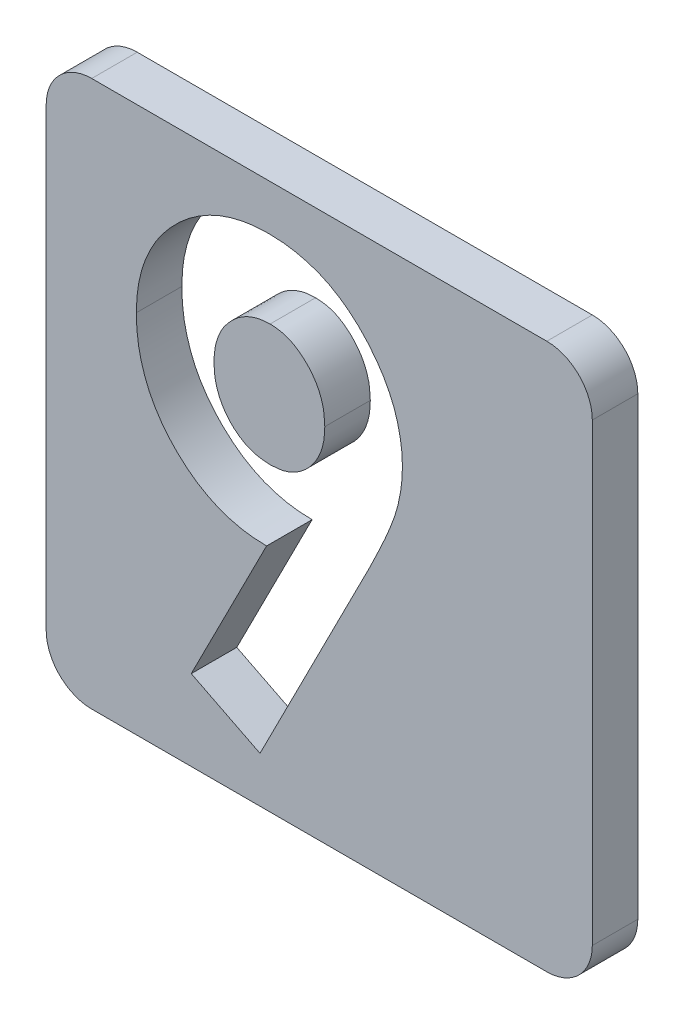
ISO-10303-21;
HEADER;
FILE_DESCRIPTION(('STEP AP214'),'2;1');
FILE_NAME('part.step','',(''),(''),'','','');
FILE_SCHEMA(('AUTOMOTIVE_DESIGN { 1 0 10303 214 1 1 1 1 }'));
ENDSEC;
DATA;
#1=APPLICATION_CONTEXT('core data for automotive mechanical design processes');
#2=APPLICATION_PROTOCOL_DEFINITION('international standard','automotive_design',2000,#1);
#3=PRODUCT_CONTEXT('',#1,'mechanical');
#4=PRODUCT('Part','Part','',(#3));
#5=PRODUCT_RELATED_PRODUCT_CATEGORY('part','',(#4));
#6=PRODUCT_DEFINITION_FORMATION('','',#4);
#7=PRODUCT_DEFINITION_CONTEXT('part definition',#1,'design');
#8=PRODUCT_DEFINITION('design','',#6,#7);
#9=PRODUCT_DEFINITION_SHAPE('','',#8);
#10=(LENGTH_UNIT() NAMED_UNIT(*) SI_UNIT(.MILLI.,.METRE.));
#11=(NAMED_UNIT(*) PLANE_ANGLE_UNIT() SI_UNIT($,.RADIAN.));
#12=(NAMED_UNIT(*) SI_UNIT($,.STERADIAN.) SOLID_ANGLE_UNIT());
#13=UNCERTAINTY_MEASURE_WITH_UNIT(LENGTH_MEASURE(1.E-05),#10,'distance_accuracy_value','');
#14=(GEOMETRIC_REPRESENTATION_CONTEXT(3) GLOBAL_UNCERTAINTY_ASSIGNED_CONTEXT((#13)) GLOBAL_UNIT_ASSIGNED_CONTEXT((#10,
#11,#12)) REPRESENTATION_CONTEXT('',''));
#15=CARTESIAN_POINT('',(0.,0.,0.));
#16=DIRECTION('',(0.,0.,1.));
#17=DIRECTION('',(1.,0.,0.));
#18=AXIS2_PLACEMENT_3D('',#15,#16,#17);
#19=CARTESIAN_POINT('',(50.,50.,10.));
#20=DIRECTION('',(0.,0.,-1.));
#21=DIRECTION('',(-1.,0.,0.));
#22=AXIS2_PLACEMENT_3D('',#19,#20,#21);
#23=PLANE('',#22);
#24=DIRECTION('',(1.,0.,0.));
#25=VECTOR('',#24,1.);
#26=CARTESIAN_POINT('',(-49.9999999999999,60.,10.));
#27=LINE('',#26,#25);
#28=CARTESIAN_POINT('',(-49.9999999999999,60.,10.));
#29=VERTEX_POINT('',#28);
#30=CARTESIAN_POINT('',(49.9999999999999,60.,10.));
#31=VERTEX_POINT('',#30);
#32=EDGE_CURVE('E280',#29,#31,#27,.T.);
#33=ORIENTED_EDGE('',*,*,#32,.F.);
#34=CARTESIAN_POINT('',(-50.,50.,10.));
#35=DIRECTION('',(0.,0.,1.));
#36=DIRECTION('',(1.,0.,0.));
#37=AXIS2_PLACEMENT_3D('',#34,#35,#36);
#38=CIRCLE('',#37,10.);
#39=CARTESIAN_POINT('',(-60.,49.9999999999999,10.));
#40=VERTEX_POINT('',#39);
#41=EDGE_CURVE('E301',#29,#40,#38,.T.);
#42=ORIENTED_EDGE('',*,*,#41,.T.);
#43=DIRECTION('',(0.,-1.,0.));
#44=VECTOR('',#43,1.);
#45=CARTESIAN_POINT('',(-60.,49.9999999999999,10.));
#46=LINE('',#45,#44);
#47=CARTESIAN_POINT('',(-60.,-49.9999999999999,10.));
#48=VERTEX_POINT('',#47);
#49=EDGE_CURVE('E299',#40,#48,#46,.T.);
#50=ORIENTED_EDGE('',*,*,#49,.T.);
#51=CARTESIAN_POINT('',(-50.,-50.,10.));
#52=DIRECTION('',(0.,0.,1.));
#53=DIRECTION('',(1.,0.,0.));
#54=AXIS2_PLACEMENT_3D('',#51,#52,#53);
#55=CIRCLE('',#54,10.);
#56=CARTESIAN_POINT('',(-49.9999999999999,-60.,10.));
#57=VERTEX_POINT('',#56);
#58=EDGE_CURVE('E297',#48,#57,#55,.T.);
#59=ORIENTED_EDGE('',*,*,#58,.T.);
#60=DIRECTION('',(1.,0.,0.));
#61=VECTOR('',#60,1.);
#62=CARTESIAN_POINT('',(-49.9999999999999,-60.,10.));
#63=LINE('',#62,#61);
#64=CARTESIAN_POINT('',(49.9999999999999,-60.,10.));
#65=VERTEX_POINT('',#64);
#66=EDGE_CURVE('E295',#57,#65,#63,.T.);
#67=ORIENTED_EDGE('',*,*,#66,.T.);
#68=CARTESIAN_POINT('',(50.,-50.,10.));
#69=DIRECTION('',(0.,0.,1.));
#70=DIRECTION('',(1.,0.,0.));
#71=AXIS2_PLACEMENT_3D('',#68,#69,#70);
#72=CIRCLE('',#71,10.);
#73=CARTESIAN_POINT('',(60.,-50.,10.));
#74=VERTEX_POINT('',#73);
#75=EDGE_CURVE('E186',#65,#74,#72,.T.);
#76=ORIENTED_EDGE('',*,*,#75,.T.);
#77=DIRECTION('',(0.,-1.,0.));
#78=VECTOR('',#77,1.);
#79=CARTESIAN_POINT('',(60.,49.9999999999999,10.));
#80=LINE('',#79,#78);
#81=CARTESIAN_POINT('',(60.,49.9999999999999,10.));
#82=VERTEX_POINT('',#81);
#83=EDGE_CURVE('E290',#82,#74,#80,.T.);
#84=ORIENTED_EDGE('',*,*,#83,.F.);
#85=CARTESIAN_POINT('',(50.,50.,10.));
#86=DIRECTION('',(0.,0.,-1.));
#87=DIRECTION('',(-1.,0.,0.));
#88=AXIS2_PLACEMENT_3D('',#85,#86,#87);
#89=CIRCLE('',#88,10.);
#90=EDGE_CURVE('E285',#31,#82,#89,.T.);
#91=ORIENTED_EDGE('',*,*,#90,.F.);
#92=EDGE_LOOP('',(#33,#42,#50,#59,#67,#76,#84,#91));
#93=FACE_BOUND('',#92,.T.);
#94=DIRECTION('',(-0.453063813676766,-0.891478087636855,0.));
#95=VECTOR('',#94,1.);
#96=CARTESIAN_POINT('',(11.1137820512821,-2.45492788461538,10.));
#97=LINE('',#96,#95);
#98=CARTESIAN_POINT('',(11.1137820512821,-2.45492788461538,10.));
#99=VERTEX_POINT('',#98);
#100=CARTESIAN_POINT('',(-13.0168269230769,-49.9358974358974,10.));
#101=VERTEX_POINT('',#100);
#102=EDGE_CURVE('E99',#99,#101,#97,.T.);
#103=ORIENTED_EDGE('',*,*,#102,.T.);
#104=DIRECTION('',(-0.893073384293623,0.44991102483306,0.));
#105=VECTOR('',#104,1.);
#106=CARTESIAN_POINT('',(-13.0168269230769,-49.9358974358974,10.));
#107=LINE('',#106,#105);
#108=CARTESIAN_POINT('',(-28.1270032051282,-42.3237179487179,10.));
#109=VERTEX_POINT('',#108);
#110=EDGE_CURVE('E89',#101,#109,#107,.T.);
#111=ORIENTED_EDGE('',*,*,#110,.T.);
#112=DIRECTION('',(0.453036279251149,0.891492080549387,0.));
#113=VECTOR('',#112,1.);
#114=CARTESIAN_POINT('',(-28.1270032051282,-42.3237179487179,10.));
#115=LINE('',#114,#113);
#116=CARTESIAN_POINT('',(-11.5705128205128,-9.74358974358974,10.));
#117=VERTEX_POINT('',#116);
#118=EDGE_CURVE('E162',#109,#117,#115,.T.);
#119=ORIENTED_EDGE('',*,*,#118,.T.);
#120=CARTESIAN_POINT('',(-11.5705128205128,-9.74358974358974,10.));
#121=CARTESIAN_POINT('',(-12.5487082784052,-9.71865684169117,10.));
#122=CARTESIAN_POINT('',(-14.4691426352712,-9.66970752278353,10.));
#123=CARTESIAN_POINT('',(-17.2968324055117,-9.26293912647587,10.));
#124=CARTESIAN_POINT('',(-20.0008840528839,-8.5685595136517,10.));
#125=CARTESIAN_POINT('',(-22.6131694405603,-7.64416532013707,10.));
#126=CARTESIAN_POINT('',(-25.097561487791,-6.40491911821241,10.));
#127=CARTESIAN_POINT('',(-27.4841854350134,-4.9259438080766,10.));
#128=CARTESIAN_POINT('',(-29.7400023394509,-3.14897623344527,10.));
#129=CARTESIAN_POINT('',(-31.87558877679,-1.15159120433424,10.));
#130=CARTESIAN_POINT('',(-33.8254474477791,1.05616578589798,10.));
#131=CARTESIAN_POINT('',(-35.5178835270646,3.43057106437143,10.));
#132=CARTESIAN_POINT('',(-36.9930362417693,5.911392924908,10.));
#133=CARTESIAN_POINT('',(-38.1401959046651,8.55463771705473,10.));
#134=CARTESIAN_POINT('',(-39.0616003817339,11.3110419237815,10.));
#135=CARTESIAN_POINT('',(-39.7348249532374,14.1948729963102,10.));
#136=CARTESIAN_POINT('',(-40.1126207772804,17.2187833329912,10.));
#137=CARTESIAN_POINT('',(-40.1654259378608,19.2768236366779,10.));
#138=CARTESIAN_POINT('',(-40.1923076923077,20.3245192307692,10.));
#139=B_SPLINE_CURVE_WITH_KNOTS('',3,(#120,#121,#122,#123,#124,#125,#126,#127,#128,#129,#130,
#131,#132,#133,#134,#135,#136,#137,#138),.UNSPECIFIED.,.F.,.F.,(4,1,1,1,1,1,1,1,1,1,1,1,1,1,1,1,
4),(0.,0.0633960183629043,0.124461722624391,0.184704908663736,0.244152607009593,
0.303740956361286,0.364332634738895,0.42586459095349,0.489579919718536,0.553682917096973,
0.61645160827579,0.678378074395185,0.7404259476886,0.802847463493209,0.866590655815861,
0.932084720662687,1.),.UNSPECIFIED.);
#140=CARTESIAN_POINT('',(-40.1923076923077,20.3245192307692,10.));
#141=VERTEX_POINT('',#140);
#142=EDGE_CURVE('E170',#117,#141,#139,.T.);
#143=ORIENTED_EDGE('',*,*,#142,.T.);
#144=CARTESIAN_POINT('',(-40.1923076923077,20.3245192307692,10.));
#145=CARTESIAN_POINT('',(-40.1673733997281,21.3407736328703,10.));
#146=CARTESIAN_POINT('',(-40.1182408920945,23.3432819057518,10.));
#147=CARTESIAN_POINT('',(-39.710190668345,26.2823123746299,10.));
#148=CARTESIAN_POINT('',(-39.0386456077103,29.1042110067751,10.));
#149=CARTESIAN_POINT('',(-38.1173098436622,31.8084984034038,10.));
#150=CARTESIAN_POINT('',(-36.8907774827536,34.3769390831891,10.));
#151=CARTESIAN_POINT('',(-35.455152573334,36.8497488680693,10.));
#152=CARTESIAN_POINT('',(-33.7001662598546,39.175767992265,10.));
#153=CARTESIAN_POINT('',(-31.7176287709224,41.36506579395,10.));
#154=CARTESIAN_POINT('',(-29.5478467051494,43.3678867288314,10.));
#155=CARTESIAN_POINT('',(-27.2458900687447,45.1288557751048,10.));
#156=CARTESIAN_POINT('',(-24.8222255223714,46.6008566917462,10.));
#157=CARTESIAN_POINT('',(-22.3079995576388,47.8370659065537,10.));
#158=CARTESIAN_POINT('',(-19.6577657129372,48.7606845299356,10.));
#159=CARTESIAN_POINT('',(-16.9098228358612,49.4575479363277,10.));
#160=CARTESIAN_POINT('',(-14.0437005674087,49.8597377152276,10.));
#161=CARTESIAN_POINT('',(-12.0982365477929,49.9103077210116,10.));
#162=CARTESIAN_POINT('',(-11.1137820512821,49.9358974358974,10.));
#163=B_SPLINE_CURVE_WITH_KNOTS('',3,(#144,#145,#146,#147,#148,#149,#150,#151,#152,#153,#154,
#155,#156,#157,#158,#159,#160,#161,#162),.UNSPECIFIED.,.F.,.F.,(4,1,1,1,1,1,1,1,1,1,1,1,1,1,1,1,
4),(0.,0.0659711673855696,0.12999482037974,0.192240605438808,0.254118655473896,
0.315112885237514,0.376787677634344,0.439482994641294,0.503934568554464,0.568359809906512,
0.630973880248219,0.6918009640577,0.752229223324359,0.812552090511615,0.873694973395468,
0.936086429705698,1.),.UNSPECIFIED.);
#164=CARTESIAN_POINT('',(-11.1137820512821,49.9358974358974,10.));
#165=VERTEX_POINT('',#164);
#166=EDGE_CURVE('E177',#141,#165,#163,.T.);
#167=ORIENTED_EDGE('',*,*,#166,.T.);
#168=CARTESIAN_POINT('',(-11.1137820512821,49.9358974358974,10.));
#169=CARTESIAN_POINT('',(-10.0844157877673,49.9147090444259,10.));
#170=CARTESIAN_POINT('',(-8.06030630915738,49.8730449394964,10.));
#171=CARTESIAN_POINT('',(-5.0972818468453,49.4132979731475,10.));
#172=CARTESIAN_POINT('',(-2.26237997427785,48.7079620288691,10.));
#173=CARTESIAN_POINT('',(0.455917974564816,47.7499719235781,10.));
#174=CARTESIAN_POINT('',(3.02386547494618,46.4497810679591,10.));
#175=CARTESIAN_POINT('',(5.46294979104408,44.8914932713447,10.));
#176=CARTESIAN_POINT('',(7.76505775226842,43.040630392274,10.));
#177=CARTESIAN_POINT('',(9.90546641613935,40.9505400356585,10.));
#178=CARTESIAN_POINT('',(11.8521441750213,38.6771757182083,10.));
#179=CARTESIAN_POINT('',(13.5776317876263,36.2975117085108,10.));
#180=CARTESIAN_POINT('',(15.0271146374738,33.8162009274539,10.));
#181=CARTESIAN_POINT('',(16.2143297542985,31.2553882185978,10.));
#182=CARTESIAN_POINT('',(17.1391643544446,28.6110617628975,10.));
#183=CARTESIAN_POINT('',(17.7748702771179,25.8794706898304,10.));
#184=CARTESIAN_POINT('',(18.1969085044112,23.0652861386496,10.));
#185=CARTESIAN_POINT('',(18.244928030853,21.1570610395622,10.));
#186=CARTESIAN_POINT('',(18.2692307692308,20.1913060897436,10.));
#187=B_SPLINE_CURVE_WITH_KNOTS('',3,(#168,#169,#170,#171,#172,#173,#174,#175,#176,#177,#178,
#179,#180,#181,#182,#183,#184,#185,#186),.UNSPECIFIED.,.F.,.F.,(4,1,1,1,1,1,1,1,1,1,1,1,1,1,1,1,
4),(0.,0.0664266296749589,0.130618979388443,0.193114419668131,0.254924025574817,
0.316297675546927,0.378571182906922,0.441525471023996,0.50670755899362,0.571491939544167,
0.634591343635348,0.696280008578515,0.756765385876679,0.816620428487902,0.876834678656504,
0.93766588711659,1.),.UNSPECIFIED.);
#188=CARTESIAN_POINT('',(18.2692307692308,20.1913060897436,10.));
#189=VERTEX_POINT('',#188);
#190=EDGE_CURVE('E256',#165,#189,#187,.T.);
#191=ORIENTED_EDGE('',*,*,#190,.T.);
#192=CARTESIAN_POINT('',(18.2692307692308,20.1913060897436,10.));
#193=CARTESIAN_POINT('',(18.2559685385925,19.4547477210231,10.));
#194=CARTESIAN_POINT('',(18.2292554242534,17.9711535612039,10.));
#195=CARTESIAN_POINT('',(17.9665917922663,15.7463433011461,10.));
#196=CARTESIAN_POINT('',(17.5680781384173,13.5153667573277,10.));
#197=CARTESIAN_POINT('',(17.1055186865444,11.6396688126471,10.));
#198=CARTESIAN_POINT('',(16.6205894510406,10.0585693740338,10.));
#199=CARTESIAN_POINT('',(16.1486980801047,8.71729972019781,10.));
#200=CARTESIAN_POINT('',(15.5432475600032,7.22823857101684,10.));
#201=CARTESIAN_POINT('',(14.8672015376338,5.58140509080897,10.));
#202=CARTESIAN_POINT('',(14.0842606766268,3.78402084299924,10.));
#203=CARTESIAN_POINT('',(13.1781921387281,1.84467800865937,10.));
#204=CARTESIAN_POINT('',(12.2037562238721,-0.265385795089937,10.));
#205=CARTESIAN_POINT('',(11.4855007657905,-1.70821865851829,10.));
#206=CARTESIAN_POINT('',(11.1137820512821,-2.45492788461538,10.));
#207=B_SPLINE_CURVE_WITH_KNOTS('',3,(#192,#193,#194,#195,#196,#197,#198,#199,#200,#201,#202,
#203,#204,#205,#206),.UNSPECIFIED.,.F.,.F.,(4,1,1,1,1,1,1,1,1,1,1,1,4),(0.,0.0920943170852741,
0.185498660774979,0.279815204103102,0.375457413897099,0.426909121720572,0.48663397338517,
0.553231376301778,0.627937493472951,0.709307196629626,0.798417104070447,0.895674813050554,1.),.UNSPECIFIED.);
#208=EDGE_CURVE('E257',#189,#99,#207,.T.);
#209=ORIENTED_EDGE('',*,*,#208,.T.);
#210=EDGE_LOOP('',(#103,#111,#119,#143,#167,#191,#209));
#211=FACE_BOUND('',#210,.T.);
#212=ADVANCED_FACE('F43',(#93,#211),#23,.F.);
#213=CARTESIAN_POINT('',(50.,50.,0.));
#214=DIRECTION('',(0.,0.,-1.));
#215=DIRECTION('',(-1.,0.,0.));
#216=AXIS2_PLACEMENT_3D('',#213,#214,#215);
#217=PLANE('',#216);
#218=DIRECTION('',(1.,0.,0.));
#219=VECTOR('',#218,1.);
#220=CARTESIAN_POINT('',(-49.9999999999999,60.,0.));
#221=LINE('',#220,#219);
#222=CARTESIAN_POINT('',(-49.9999999999999,60.,0.));
#223=VERTEX_POINT('',#222);
#224=CARTESIAN_POINT('',(49.9999999999999,60.,0.));
#225=VERTEX_POINT('',#224);
#226=EDGE_CURVE('E223',#223,#225,#221,.T.);
#227=ORIENTED_EDGE('',*,*,#226,.T.);
#228=CARTESIAN_POINT('',(50.,50.,0.));
#229=DIRECTION('',(0.,0.,-1.));
#230=DIRECTION('',(-1.,0.,0.));
#231=AXIS2_PLACEMENT_3D('',#228,#229,#230);
#232=CIRCLE('',#231,10.);
#233=CARTESIAN_POINT('',(60.,49.9999999999999,0.));
#234=VERTEX_POINT('',#233);
#235=EDGE_CURVE('E304',#225,#234,#232,.T.);
#236=ORIENTED_EDGE('',*,*,#235,.T.);
#237=DIRECTION('',(0.,-1.,0.));
#238=VECTOR('',#237,1.);
#239=CARTESIAN_POINT('',(60.,49.9999999999999,0.));
#240=LINE('',#239,#238);
#241=CARTESIAN_POINT('',(60.,-50.,0.));
#242=VERTEX_POINT('',#241);
#243=EDGE_CURVE('E284',#234,#242,#240,.T.);
#244=ORIENTED_EDGE('',*,*,#243,.T.);
#245=CARTESIAN_POINT('',(50.,-50.,0.));
#246=DIRECTION('',(0.,0.,1.));
#247=DIRECTION('',(1.,0.,0.));
#248=AXIS2_PLACEMENT_3D('',#245,#246,#247);
#249=CIRCLE('',#248,10.);
#250=CARTESIAN_POINT('',(49.9999999999999,-60.,0.));
#251=VERTEX_POINT('',#250);
#252=EDGE_CURVE('E308',#251,#242,#249,.T.);
#253=ORIENTED_EDGE('',*,*,#252,.F.);
#254=DIRECTION('',(1.,0.,0.));
#255=VECTOR('',#254,1.);
#256=CARTESIAN_POINT('',(-49.9999999999999,-60.,0.));
#257=LINE('',#256,#255);
#258=CARTESIAN_POINT('',(-49.9999999999999,-60.,0.));
#259=VERTEX_POINT('',#258);
#260=EDGE_CURVE('E312',#259,#251,#257,.T.);
#261=ORIENTED_EDGE('',*,*,#260,.F.);
#262=CARTESIAN_POINT('',(-50.,-50.,0.));
#263=DIRECTION('',(0.,0.,1.));
#264=DIRECTION('',(1.,0.,0.));
#265=AXIS2_PLACEMENT_3D('',#262,#263,#264);
#266=CIRCLE('',#265,10.);
#267=CARTESIAN_POINT('',(-60.,-49.9999999999999,0.));
#268=VERTEX_POINT('',#267);
#269=EDGE_CURVE('E315',#268,#259,#266,.T.);
#270=ORIENTED_EDGE('',*,*,#269,.F.);
#271=DIRECTION('',(0.,-1.,0.));
#272=VECTOR('',#271,1.);
#273=CARTESIAN_POINT('',(-60.,49.9999999999999,0.));
#274=LINE('',#273,#272);
#275=CARTESIAN_POINT('',(-60.,49.9999999999999,0.));
#276=VERTEX_POINT('',#275);
#277=EDGE_CURVE('E318',#276,#268,#274,.T.);
#278=ORIENTED_EDGE('',*,*,#277,.F.);
#279=CARTESIAN_POINT('',(-50.,50.,0.));
#280=DIRECTION('',(0.,0.,1.));
#281=DIRECTION('',(1.,0.,0.));
#282=AXIS2_PLACEMENT_3D('',#279,#280,#281);
#283=CIRCLE('',#282,10.);
#284=EDGE_CURVE('E321',#223,#276,#283,.T.);
#285=ORIENTED_EDGE('',*,*,#284,.F.);
#286=EDGE_LOOP('',(#227,#236,#244,#253,#261,#270,#278,#285));
#287=FACE_BOUND('',#286,.T.);
#288=DIRECTION('',(-0.893073384293623,0.44991102483306,0.));
#289=VECTOR('',#288,1.);
#290=CARTESIAN_POINT('',(-13.0168269230769,-49.9358974358974,0.));
#291=LINE('',#290,#289);
#292=CARTESIAN_POINT('',(-13.0168269230769,-49.9358974358974,0.));
#293=VERTEX_POINT('',#292);
#294=CARTESIAN_POINT('',(-28.1270032051282,-42.3237179487179,0.));
#295=VERTEX_POINT('',#294);
#296=EDGE_CURVE('E85',#293,#295,#291,.T.);
#297=ORIENTED_EDGE('',*,*,#296,.F.);
#298=DIRECTION('',(-0.453063813676766,-0.891478087636855,0.));
#299=VECTOR('',#298,1.);
#300=CARTESIAN_POINT('',(11.1137820512821,-2.45492788461538,0.));
#301=LINE('',#300,#299);
#302=CARTESIAN_POINT('',(11.1137820512821,-2.45492788461538,0.));
#303=VERTEX_POINT('',#302);
#304=EDGE_CURVE('E46',#303,#293,#301,.T.);
#305=ORIENTED_EDGE('',*,*,#304,.F.);
#306=CARTESIAN_POINT('',(18.2692307692308,20.1913060897436,0.));
#307=CARTESIAN_POINT('',(18.2559685385925,19.4547477210231,0.));
#308=CARTESIAN_POINT('',(18.2292554242534,17.9711535612039,0.));
#309=CARTESIAN_POINT('',(17.9665917922663,15.7463433011461,0.));
#310=CARTESIAN_POINT('',(17.5680781384173,13.5153667573277,0.));
#311=CARTESIAN_POINT('',(17.1055186865444,11.6396688126471,0.));
#312=CARTESIAN_POINT('',(16.6205894510406,10.0585693740338,0.));
#313=CARTESIAN_POINT('',(16.1486980801047,8.71729972019781,0.));
#314=CARTESIAN_POINT('',(15.5432475600032,7.22823857101684,0.));
#315=CARTESIAN_POINT('',(14.8672015376338,5.58140509080897,0.));
#316=CARTESIAN_POINT('',(14.0842606766268,3.78402084299924,0.));
#317=CARTESIAN_POINT('',(13.1781921387281,1.84467800865937,0.));
#318=CARTESIAN_POINT('',(12.2037562238721,-0.265385795089937,0.));
#319=CARTESIAN_POINT('',(11.4855007657905,-1.70821865851829,0.));
#320=CARTESIAN_POINT('',(11.1137820512821,-2.45492788461538,0.));
#321=B_SPLINE_CURVE_WITH_KNOTS('',3,(#306,#307,#308,#309,#310,#311,#312,#313,#314,#315,#316,
#317,#318,#319,#320),.UNSPECIFIED.,.F.,.F.,(4,1,1,1,1,1,1,1,1,1,1,1,4),(0.,0.0920943170852741,
0.185498660774979,0.279815204103102,0.375457413897099,0.426909121720572,0.48663397338517,
0.553231376301778,0.627937493472951,0.709307196629626,0.798417104070447,0.895674813050554,1.),.UNSPECIFIED.);
#322=CARTESIAN_POINT('',(18.2692307692308,20.1913060897436,0.));
#323=VERTEX_POINT('',#322);
#324=EDGE_CURVE('E52',#323,#303,#321,.T.);
#325=ORIENTED_EDGE('',*,*,#324,.F.);
#326=CARTESIAN_POINT('',(-11.1137820512821,49.9358974358974,0.));
#327=CARTESIAN_POINT('',(-10.0844157877673,49.9147090444259,0.));
#328=CARTESIAN_POINT('',(-8.06030630915738,49.8730449394964,0.));
#329=CARTESIAN_POINT('',(-5.0972818468453,49.4132979731475,0.));
#330=CARTESIAN_POINT('',(-2.26237997427785,48.7079620288691,0.));
#331=CARTESIAN_POINT('',(0.455917974564816,47.7499719235781,0.));
#332=CARTESIAN_POINT('',(3.02386547494618,46.4497810679591,0.));
#333=CARTESIAN_POINT('',(5.46294979104408,44.8914932713447,0.));
#334=CARTESIAN_POINT('',(7.76505775226842,43.040630392274,0.));
#335=CARTESIAN_POINT('',(9.90546641613935,40.9505400356585,0.));
#336=CARTESIAN_POINT('',(11.8521441750213,38.6771757182083,0.));
#337=CARTESIAN_POINT('',(13.5776317876263,36.2975117085108,0.));
#338=CARTESIAN_POINT('',(15.0271146374738,33.8162009274539,0.));
#339=CARTESIAN_POINT('',(16.2143297542985,31.2553882185978,0.));
#340=CARTESIAN_POINT('',(17.1391643544446,28.6110617628975,0.));
#341=CARTESIAN_POINT('',(17.7748702771179,25.8794706898304,0.));
#342=CARTESIAN_POINT('',(18.1969085044112,23.0652861386496,0.));
#343=CARTESIAN_POINT('',(18.244928030853,21.1570610395622,0.));
#344=CARTESIAN_POINT('',(18.2692307692308,20.1913060897436,0.));
#345=B_SPLINE_CURVE_WITH_KNOTS('',3,(#326,#327,#328,#329,#330,#331,#332,#333,#334,#335,#336,
#337,#338,#339,#340,#341,#342,#343,#344),.UNSPECIFIED.,.F.,.F.,(4,1,1,1,1,1,1,1,1,1,1,1,1,1,1,1,
4),(0.,0.0664266296749589,0.130618979388443,0.193114419668131,0.254924025574817,
0.316297675546927,0.378571182906922,0.441525471023996,0.50670755899362,0.571491939544167,
0.634591343635348,0.696280008578515,0.756765385876679,0.816620428487902,0.876834678656504,
0.93766588711659,1.),.UNSPECIFIED.);
#346=CARTESIAN_POINT('',(-11.1137820512821,49.9358974358974,0.));
#347=VERTEX_POINT('',#346);
#348=EDGE_CURVE('E192',#347,#323,#345,.T.);
#349=ORIENTED_EDGE('',*,*,#348,.F.);
#350=CARTESIAN_POINT('',(-40.1923076923077,20.3245192307692,0.));
#351=CARTESIAN_POINT('',(-40.1673733997281,21.3407736328703,0.));
#352=CARTESIAN_POINT('',(-40.1182408920945,23.3432819057518,0.));
#353=CARTESIAN_POINT('',(-39.710190668345,26.2823123746299,0.));
#354=CARTESIAN_POINT('',(-39.0386456077103,29.1042110067751,0.));
#355=CARTESIAN_POINT('',(-38.1173098436622,31.8084984034038,0.));
#356=CARTESIAN_POINT('',(-36.8907774827536,34.3769390831891,0.));
#357=CARTESIAN_POINT('',(-35.455152573334,36.8497488680693,0.));
#358=CARTESIAN_POINT('',(-33.7001662598546,39.175767992265,0.));
#359=CARTESIAN_POINT('',(-31.7176287709224,41.36506579395,0.));
#360=CARTESIAN_POINT('',(-29.5478467051494,43.3678867288314,0.));
#361=CARTESIAN_POINT('',(-27.2458900687447,45.1288557751048,0.));
#362=CARTESIAN_POINT('',(-24.8222255223714,46.6008566917462,0.));
#363=CARTESIAN_POINT('',(-22.3079995576388,47.8370659065537,0.));
#364=CARTESIAN_POINT('',(-19.6577657129372,48.7606845299356,0.));
#365=CARTESIAN_POINT('',(-16.9098228358612,49.4575479363277,0.));
#366=CARTESIAN_POINT('',(-14.0437005674087,49.8597377152276,0.));
#367=CARTESIAN_POINT('',(-12.0982365477929,49.9103077210116,0.));
#368=CARTESIAN_POINT('',(-11.1137820512821,49.9358974358974,0.));
#369=B_SPLINE_CURVE_WITH_KNOTS('',3,(#350,#351,#352,#353,#354,#355,#356,#357,#358,#359,#360,
#361,#362,#363,#364,#365,#366,#367,#368),.UNSPECIFIED.,.F.,.F.,(4,1,1,1,1,1,1,1,1,1,1,1,1,1,1,1,
4),(0.,0.0659711673855696,0.12999482037974,0.192240605438808,0.254118655473896,
0.315112885237514,0.376787677634344,0.439482994641294,0.503934568554464,0.568359809906512,
0.630973880248219,0.6918009640577,0.752229223324359,0.812552090511615,0.873694973395468,
0.936086429705698,1.),.UNSPECIFIED.);
#370=CARTESIAN_POINT('',(-40.1923076923077,20.3245192307692,0.));
#371=VERTEX_POINT('',#370);
#372=EDGE_CURVE('E233',#371,#347,#369,.T.);
#373=ORIENTED_EDGE('',*,*,#372,.F.);
#374=CARTESIAN_POINT('',(-11.5705128205128,-9.74358974358974,0.));
#375=CARTESIAN_POINT('',(-12.5487082784052,-9.71865684169117,0.));
#376=CARTESIAN_POINT('',(-14.4691426352712,-9.66970752278353,0.));
#377=CARTESIAN_POINT('',(-17.2968324055117,-9.26293912647587,0.));
#378=CARTESIAN_POINT('',(-20.0008840528839,-8.5685595136517,0.));
#379=CARTESIAN_POINT('',(-22.6131694405603,-7.64416532013707,0.));
#380=CARTESIAN_POINT('',(-25.097561487791,-6.40491911821241,0.));
#381=CARTESIAN_POINT('',(-27.4841854350134,-4.9259438080766,0.));
#382=CARTESIAN_POINT('',(-29.7400023394509,-3.14897623344527,0.));
#383=CARTESIAN_POINT('',(-31.87558877679,-1.15159120433424,0.));
#384=CARTESIAN_POINT('',(-33.8254474477791,1.05616578589798,0.));
#385=CARTESIAN_POINT('',(-35.5178835270646,3.43057106437143,0.));
#386=CARTESIAN_POINT('',(-36.9930362417693,5.911392924908,0.));
#387=CARTESIAN_POINT('',(-38.1401959046651,8.55463771705473,0.));
#388=CARTESIAN_POINT('',(-39.0616003817339,11.3110419237815,0.));
#389=CARTESIAN_POINT('',(-39.7348249532374,14.1948729963102,0.));
#390=CARTESIAN_POINT('',(-40.1126207772804,17.2187833329912,0.));
#391=CARTESIAN_POINT('',(-40.1654259378608,19.2768236366779,0.));
#392=CARTESIAN_POINT('',(-40.1923076923077,20.3245192307692,0.));
#393=B_SPLINE_CURVE_WITH_KNOTS('',3,(#374,#375,#376,#377,#378,#379,#380,#381,#382,#383,#384,
#385,#386,#387,#388,#389,#390,#391,#392),.UNSPECIFIED.,.F.,.F.,(4,1,1,1,1,1,1,1,1,1,1,1,1,1,1,1,
4),(0.,0.0633960183629043,0.124461722624391,0.184704908663736,0.244152607009593,
0.303740956361286,0.364332634738895,0.42586459095349,0.489579919718536,0.553682917096973,
0.61645160827579,0.678378074395185,0.7404259476886,0.802847463493209,0.866590655815861,
0.932084720662687,1.),.UNSPECIFIED.);
#394=CARTESIAN_POINT('',(-11.5705128205128,-9.74358974358974,0.));
#395=VERTEX_POINT('',#394);
#396=EDGE_CURVE('E167',#395,#371,#393,.T.);
#397=ORIENTED_EDGE('',*,*,#396,.F.);
#398=DIRECTION('',(0.453036279251149,0.891492080549387,0.));
#399=VECTOR('',#398,1.);
#400=CARTESIAN_POINT('',(-28.1270032051282,-42.3237179487179,0.));
#401=LINE('',#400,#399);
#402=EDGE_CURVE('E164',#295,#395,#401,.T.);
#403=ORIENTED_EDGE('',*,*,#402,.F.);
#404=EDGE_LOOP('',(#297,#305,#325,#349,#373,#397,#403));
#405=FACE_BOUND('',#404,.T.);
#406=ADVANCED_FACE('F206',(#287,#405),#217,.T.);
#407=CARTESIAN_POINT('',(-49.9999999999999,60.,10.));
#408=DIRECTION('',(0.,1.,0.));
#409=DIRECTION('',(0.,0.,1.));
#410=AXIS2_PLACEMENT_3D('',#407,#408,#409);
#411=PLANE('',#410);
#412=ORIENTED_EDGE('',*,*,#226,.F.);
#413=DIRECTION('',(0.,0.,-1.));
#414=VECTOR('',#413,1.);
#415=CARTESIAN_POINT('',(-49.9999999999999,60.,10.));
#416=LINE('',#415,#414);
#417=EDGE_CURVE('E320',#29,#223,#416,.T.);
#418=ORIENTED_EDGE('',*,*,#417,.F.);
#419=ORIENTED_EDGE('',*,*,#32,.T.);
#420=DIRECTION('',(0.,0.,-1.));
#421=VECTOR('',#420,1.);
#422=CARTESIAN_POINT('',(49.9999999999999,60.,10.));
#423=LINE('',#422,#421);
#424=EDGE_CURVE('E283',#31,#225,#423,.T.);
#425=ORIENTED_EDGE('',*,*,#424,.T.);
#426=EDGE_LOOP('',(#412,#418,#419,#425));
#427=FACE_BOUND('',#426,.T.);
#428=ADVANCED_FACE('F208',(#427),#411,.T.);
#429=CARTESIAN_POINT('',(-50.,50.,10.));
#430=DIRECTION('',(0.,0.,-1.));
#431=DIRECTION('',(-1.,0.,0.));
#432=AXIS2_PLACEMENT_3D('',#429,#430,#431);
#433=CYLINDRICAL_SURFACE('',#432,10.);
#434=ORIENTED_EDGE('',*,*,#284,.T.);
#435=DIRECTION('',(0.,0.,-1.));
#436=VECTOR('',#435,1.);
#437=CARTESIAN_POINT('',(-60.,49.9999999999999,10.));
#438=LINE('',#437,#436);
#439=EDGE_CURVE('E317',#40,#276,#438,.T.);
#440=ORIENTED_EDGE('',*,*,#439,.F.);
#441=ORIENTED_EDGE('',*,*,#41,.F.);
#442=ORIENTED_EDGE('',*,*,#417,.T.);
#443=EDGE_LOOP('',(#434,#440,#441,#442));
#444=FACE_BOUND('',#443,.T.);
#445=ADVANCED_FACE('F214',(#444),#433,.T.);
#446=CARTESIAN_POINT('',(-60.,49.9999999999999,10.));
#447=DIRECTION('',(1.,0.,0.));
#448=DIRECTION('',(0.,1.,0.));
#449=AXIS2_PLACEMENT_3D('',#446,#447,#448);
#450=PLANE('',#449);
#451=ORIENTED_EDGE('',*,*,#277,.T.);
#452=DIRECTION('',(0.,0.,-1.));
#453=VECTOR('',#452,1.);
#454=CARTESIAN_POINT('',(-60.,-49.9999999999999,10.));
#455=LINE('',#454,#453);
#456=EDGE_CURVE('E314',#48,#268,#455,.T.);
#457=ORIENTED_EDGE('',*,*,#456,.F.);
#458=ORIENTED_EDGE('',*,*,#49,.F.);
#459=ORIENTED_EDGE('',*,*,#439,.T.);
#460=EDGE_LOOP('',(#451,#457,#458,#459));
#461=FACE_BOUND('',#460,.T.);
#462=ADVANCED_FACE('F362',(#461),#450,.F.);
#463=CARTESIAN_POINT('',(-50.,-50.,10.));
#464=DIRECTION('',(0.,0.,-1.));
#465=DIRECTION('',(-1.,0.,0.));
#466=AXIS2_PLACEMENT_3D('',#463,#464,#465);
#467=CYLINDRICAL_SURFACE('',#466,10.);
#468=ORIENTED_EDGE('',*,*,#269,.T.);
#469=DIRECTION('',(0.,0.,-1.));
#470=VECTOR('',#469,1.);
#471=CARTESIAN_POINT('',(-49.9999999999999,-60.,10.));
#472=LINE('',#471,#470);
#473=EDGE_CURVE('E311',#57,#259,#472,.T.);
#474=ORIENTED_EDGE('',*,*,#473,.F.);
#475=ORIENTED_EDGE('',*,*,#58,.F.);
#476=ORIENTED_EDGE('',*,*,#456,.T.);
#477=EDGE_LOOP('',(#468,#474,#475,#476));
#478=FACE_BOUND('',#477,.T.);
#479=ADVANCED_FACE('F357',(#478),#467,.T.);
#480=CARTESIAN_POINT('',(-49.9999999999999,-60.,10.));
#481=DIRECTION('',(0.,1.,0.));
#482=DIRECTION('',(0.,0.,1.));
#483=AXIS2_PLACEMENT_3D('',#480,#481,#482);
#484=PLANE('',#483);
#485=ORIENTED_EDGE('',*,*,#260,.T.);
#486=DIRECTION('',(0.,0.,-1.));
#487=VECTOR('',#486,1.);
#488=CARTESIAN_POINT('',(49.9999999999999,-60.,10.));
#489=LINE('',#488,#487);
#490=EDGE_CURVE('E293',#65,#251,#489,.T.);
#491=ORIENTED_EDGE('',*,*,#490,.F.);
#492=ORIENTED_EDGE('',*,*,#66,.F.);
#493=ORIENTED_EDGE('',*,*,#473,.T.);
#494=EDGE_LOOP('',(#485,#491,#492,#493));
#495=FACE_BOUND('',#494,.T.);
#496=ADVANCED_FACE('F352',(#495),#484,.F.);
#497=CARTESIAN_POINT('',(50.,-50.,10.));
#498=DIRECTION('',(0.,0.,-1.));
#499=DIRECTION('',(-1.,0.,0.));
#500=AXIS2_PLACEMENT_3D('',#497,#498,#499);
#501=CYLINDRICAL_SURFACE('',#500,10.);
#502=ORIENTED_EDGE('',*,*,#252,.T.);
#503=DIRECTION('',(0.,0.,-1.));
#504=VECTOR('',#503,1.);
#505=CARTESIAN_POINT('',(60.,-50.,10.));
#506=LINE('',#505,#504);
#507=EDGE_CURVE('E289',#74,#242,#506,.T.);
#508=ORIENTED_EDGE('',*,*,#507,.F.);
#509=ORIENTED_EDGE('',*,*,#75,.F.);
#510=ORIENTED_EDGE('',*,*,#490,.T.);
#511=EDGE_LOOP('',(#502,#508,#509,#510));
#512=FACE_BOUND('',#511,.T.);
#513=ADVANCED_FACE('F348',(#512),#501,.T.);
#514=CARTESIAN_POINT('',(60.,49.9999999999999,10.));
#515=DIRECTION('',(1.,0.,0.));
#516=DIRECTION('',(0.,1.,0.));
#517=AXIS2_PLACEMENT_3D('',#514,#515,#516);
#518=PLANE('',#517);
#519=ORIENTED_EDGE('',*,*,#243,.F.);
#520=DIRECTION('',(0.,0.,-1.));
#521=VECTOR('',#520,1.);
#522=CARTESIAN_POINT('',(60.,49.9999999999999,10.));
#523=LINE('',#522,#521);
#524=EDGE_CURVE('E288',#82,#234,#523,.T.);
#525=ORIENTED_EDGE('',*,*,#524,.F.);
#526=ORIENTED_EDGE('',*,*,#83,.T.);
#527=ORIENTED_EDGE('',*,*,#507,.T.);
#528=EDGE_LOOP('',(#519,#525,#526,#527));
#529=FACE_BOUND('',#528,.T.);
#530=ADVANCED_FACE('F343',(#529),#518,.T.);
#531=CARTESIAN_POINT('',(50.,50.,10.));
#532=DIRECTION('',(0.,0.,-1.));
#533=DIRECTION('',(-1.,0.,0.));
#534=AXIS2_PLACEMENT_3D('',#531,#532,#533);
#535=CYLINDRICAL_SURFACE('',#534,10.);
#536=ORIENTED_EDGE('',*,*,#235,.F.);
#537=ORIENTED_EDGE('',*,*,#424,.F.);
#538=ORIENTED_EDGE('',*,*,#90,.T.);
#539=ORIENTED_EDGE('',*,*,#524,.T.);
#540=EDGE_LOOP('',(#536,#537,#538,#539));
#541=FACE_BOUND('',#540,.T.);
#542=ADVANCED_FACE('F338',(#541),#535,.T.);
#543=CARTESIAN_POINT('',(11.1137820512821,-2.45492788461538,0.));
#544=DIRECTION('',(-0.891478087636855,0.453063813676766,0.));
#545=DIRECTION('',(-0.453063813676766,-0.891478087636855,0.));
#546=AXIS2_PLACEMENT_3D('',#543,#544,#545);
#547=PLANE('',#546);
#548=ORIENTED_EDGE('',*,*,#102,.F.);
#549=DIRECTION('',(0.,0.,1.));
#550=VECTOR('',#549,1.);
#551=CARTESIAN_POINT('',(11.1137820512821,-2.45492788461538,0.));
#552=LINE('',#551,#550);
#553=EDGE_CURVE('E12',#303,#99,#552,.T.);
#554=ORIENTED_EDGE('',*,*,#553,.F.);
#555=ORIENTED_EDGE('',*,*,#304,.T.);
#556=DIRECTION('',(0.,0.,1.));
#557=VECTOR('',#556,1.);
#558=CARTESIAN_POINT('',(-13.0168269230769,-49.9358974358974,0.));
#559=LINE('',#558,#557);
#560=EDGE_CURVE('E225',#293,#101,#559,.T.);
#561=ORIENTED_EDGE('',*,*,#560,.T.);
#562=EDGE_LOOP('',(#548,#554,#555,#561));
#563=FACE_BOUND('',#562,.T.);
#564=ADVANCED_FACE('F374',(#563),#547,.T.);
#565=CARTESIAN_POINT('',(-13.0168269230769,-49.9358974358974,0.));
#566=DIRECTION('',(0.44991102483306,0.893073384293623,0.));
#567=DIRECTION('',(-0.893073384293623,0.44991102483306,0.));
#568=AXIS2_PLACEMENT_3D('',#565,#566,#567);
#569=PLANE('',#568);
#570=ORIENTED_EDGE('',*,*,#110,.F.);
#571=ORIENTED_EDGE('',*,*,#560,.F.);
#572=ORIENTED_EDGE('',*,*,#296,.T.);
#573=DIRECTION('',(0.,0.,1.));
#574=VECTOR('',#573,1.);
#575=CARTESIAN_POINT('',(-28.1270032051282,-42.3237179487179,0.));
#576=LINE('',#575,#574);
#577=EDGE_CURVE('E224',#295,#109,#576,.T.);
#578=ORIENTED_EDGE('',*,*,#577,.T.);
#579=EDGE_LOOP('',(#570,#571,#572,#578));
#580=FACE_BOUND('',#579,.T.);
#581=ADVANCED_FACE('F376',(#580),#569,.T.);
#582=CARTESIAN_POINT('',(-28.1270032051282,-42.3237179487179,0.));
#583=DIRECTION('',(0.891492080549387,-0.453036279251149,0.));
#584=DIRECTION('',(0.453036279251149,0.891492080549387,0.));
#585=AXIS2_PLACEMENT_3D('',#582,#583,#584);
#586=PLANE('',#585);
#587=ORIENTED_EDGE('',*,*,#118,.F.);
#588=ORIENTED_EDGE('',*,*,#577,.F.);
#589=ORIENTED_EDGE('',*,*,#402,.T.);
#590=DIRECTION('',(0.,0.,1.));
#591=VECTOR('',#590,1.);
#592=CARTESIAN_POINT('',(-11.5705128205128,-9.74358974358974,0.));
#593=LINE('',#592,#591);
#594=EDGE_CURVE('E158',#395,#117,#593,.T.);
#595=ORIENTED_EDGE('',*,*,#594,.T.);
#596=EDGE_LOOP('',(#587,#588,#589,#595));
#597=FACE_BOUND('',#596,.T.);
#598=ADVANCED_FACE('F160',(#597),#586,.T.);
#599=DIRECTION('',(0.,0.,1.));
#600=VECTOR('',#599,1.);
#601=SURFACE_OF_LINEAR_EXTRUSION('',#393,#600);
#602=ORIENTED_EDGE('',*,*,#142,.F.);
#603=ORIENTED_EDGE('',*,*,#594,.F.);
#604=ORIENTED_EDGE('',*,*,#396,.T.);
#605=DIRECTION('',(0.,0.,1.));
#606=VECTOR('',#605,1.);
#607=CARTESIAN_POINT('',(-40.1923076923077,20.3245192307692,0.));
#608=LINE('',#607,#606);
#609=EDGE_CURVE('E173',#371,#141,#608,.T.);
#610=ORIENTED_EDGE('',*,*,#609,.T.);
#611=EDGE_LOOP('',(#602,#603,#604,#610));
#612=FACE_BOUND('',#611,.T.);
#613=ADVANCED_FACE('F171',(#612),#601,.T.);
#614=DIRECTION('',(0.,0.,1.));
#615=VECTOR('',#614,1.);
#616=SURFACE_OF_LINEAR_EXTRUSION('',#369,#615);
#617=ORIENTED_EDGE('',*,*,#166,.F.);
#618=ORIENTED_EDGE('',*,*,#609,.F.);
#619=ORIENTED_EDGE('',*,*,#372,.T.);
#620=DIRECTION('',(0.,0.,1.));
#621=VECTOR('',#620,1.);
#622=CARTESIAN_POINT('',(-11.1137820512821,49.9358974358974,0.));
#623=LINE('',#622,#621);
#624=EDGE_CURVE('E253',#347,#165,#623,.T.);
#625=ORIENTED_EDGE('',*,*,#624,.T.);
#626=EDGE_LOOP('',(#617,#618,#619,#625));
#627=FACE_BOUND('',#626,.T.);
#628=ADVANCED_FACE('F243',(#627),#616,.T.);
#629=DIRECTION('',(0.,0.,1.));
#630=VECTOR('',#629,1.);
#631=SURFACE_OF_LINEAR_EXTRUSION('',#345,#630);
#632=ORIENTED_EDGE('',*,*,#190,.F.);
#633=ORIENTED_EDGE('',*,*,#624,.F.);
#634=ORIENTED_EDGE('',*,*,#348,.T.);
#635=DIRECTION('',(0.,0.,1.));
#636=VECTOR('',#635,1.);
#637=CARTESIAN_POINT('',(18.2692307692308,20.1913060897436,0.));
#638=LINE('',#637,#636);
#639=EDGE_CURVE('E191',#323,#189,#638,.T.);
#640=ORIENTED_EDGE('',*,*,#639,.T.);
#641=EDGE_LOOP('',(#632,#633,#634,#640));
#642=FACE_BOUND('',#641,.T.);
#643=ADVANCED_FACE('F204',(#642),#631,.T.);
#644=DIRECTION('',(0.,0.,1.));
#645=VECTOR('',#644,1.);
#646=SURFACE_OF_LINEAR_EXTRUSION('',#321,#645);
#647=ORIENTED_EDGE('',*,*,#208,.F.);
#648=ORIENTED_EDGE('',*,*,#639,.F.);
#649=ORIENTED_EDGE('',*,*,#324,.T.);
#650=ORIENTED_EDGE('',*,*,#553,.T.);
#651=EDGE_LOOP('',(#647,#648,#649,#650));
#652=FACE_BOUND('',#651,.T.);
#653=ADVANCED_FACE('F201',(#652),#646,.T.);
#654=CLOSED_SHELL('',(#212,#406,#428,#445,#462,#479,#496,#513,#530,#542,#564,#581,#598,#613,
#628,#643,#653));
#655=MANIFOLD_SOLID_BREP('B2',#654);
#656=CARTESIAN_POINT('',(50.,50.,0.));
#657=DIRECTION('',(0.,0.,-1.));
#658=DIRECTION('',(-1.,0.,0.));
#659=AXIS2_PLACEMENT_3D('',#656,#657,#658);
#660=PLANE('',#659);
#661=CARTESIAN_POINT('',(-10.7331730769231,6.08974358974359,0.));
#662=CARTESIAN_POINT('',(-9.9161466819083,6.13784430098724,0.));
#663=CARTESIAN_POINT('',(-8.31986209576,6.23182219987705,0.));
#664=CARTESIAN_POINT('',(-6.02690544607803,6.9584793425745,0.));
#665=CARTESIAN_POINT('',(-3.97482582569778,8.20198705828346,0.));
#666=CARTESIAN_POINT('',(-2.15599316366413,9.85400362035696,0.));
#667=CARTESIAN_POINT('',(-0.652965524949718,11.8695393936226,0.));
#668=CARTESIAN_POINT('',(0.439833923338013,14.164047711335,0.));
#669=CARTESIAN_POINT('',(1.11296474480748,16.6900118333244,0.));
#670=CARTESIAN_POINT('',(1.18228185290637,18.4489243359776,0.));
#671=CARTESIAN_POINT('',(1.21794871794872,19.3539663461538,0.));
#672=B_SPLINE_CURVE_WITH_KNOTS('',3,(#661,#662,#663,#664,#665,#666,#667,#668,#669,#670,#671),
.UNSPECIFIED.,.F.,.F.,(4,1,1,1,1,1,1,1,4),(0.,0.123096872281281,0.240503417055605,
0.358481646161694,0.482438154266907,0.608924050935969,0.735167266003008,0.863731283065201,1.),.UNSPECIFIED.);
#673=CARTESIAN_POINT('',(-10.7331730769231,6.08974358974359,0.));
#674=VERTEX_POINT('',#673);
#675=CARTESIAN_POINT('',(1.21794871794872,19.3539663461538,0.));
#676=VERTEX_POINT('',#675);
#677=EDGE_CURVE('E554',#674,#676,#672,.T.);
#678=ORIENTED_EDGE('',*,*,#677,.F.);
#679=CARTESIAN_POINT('',(-23.1410256410256,19.4110576923077,0.));
#680=CARTESIAN_POINT('',(-23.0988037385086,18.4995551637725,0.));
#681=CARTESIAN_POINT('',(-23.016686546862,16.7267779235242,0.));
#682=CARTESIAN_POINT('',(-22.32846097474,14.1864880669142,0.));
#683=CARTESIAN_POINT('',(-21.2074104803546,11.8798370232174,0.));
#684=CARTESIAN_POINT('',(-19.6748544801613,9.84840588288505,0.));
#685=CARTESIAN_POINT('',(-17.7871228964553,8.18824965704678,0.));
#686=CARTESIAN_POINT('',(-15.6437490142241,6.95798780894708,0.));
#687=CARTESIAN_POINT('',(-13.2528650317312,6.22985186940172,0.));
#688=CARTESIAN_POINT('',(-11.5881894932275,6.13728705192724,0.));
#689=CARTESIAN_POINT('',(-10.7331730769231,6.08974358974359,0.));
#690=B_SPLINE_CURVE_WITH_KNOTS('',3,(#679,#680,#681,#682,#683,#684,#685,#686,#687,#688,#689),
.UNSPECIFIED.,.F.,.F.,(4,1,1,1,1,1,1,1,4),(0.,0.1344633271833,0.261517130908762,
0.385560358177889,0.511308304196499,0.634801762508435,0.754394439049976,0.873851221039326,1.),.UNSPECIFIED.);
#691=CARTESIAN_POINT('',(-23.1410256410256,19.4110576923077,0.));
#692=VERTEX_POINT('',#691);
#693=EDGE_CURVE('E523',#692,#674,#690,.T.);
#694=ORIENTED_EDGE('',*,*,#693,.F.);
#695=CARTESIAN_POINT('',(-10.7902644230769,32.8846153846154,0.));
#696=CARTESIAN_POINT('',(-11.6145093617645,32.8385740555131,0.));
#697=CARTESIAN_POINT('',(-13.2329075527386,32.748172282652,0.));
#698=CARTESIAN_POINT('',(-15.5543436849758,31.9817074236397,0.));
#699=CARTESIAN_POINT('',(-17.6943433777227,30.7630870406502,0.));
#700=CARTESIAN_POINT('',(-19.5631564826773,29.0563905597123,0.));
#701=CARTESIAN_POINT('',(-21.1805425631229,27.0506785921793,0.));
#702=CARTESIAN_POINT('',(-22.3083900302363,24.7046561393793,0.));
#703=CARTESIAN_POINT('',(-23.0219054413766,22.1361094885893,0.));
#704=CARTESIAN_POINT('',(-23.1006049604336,20.3357408995129,0.));
#705=CARTESIAN_POINT('',(-23.1410256410256,19.4110576923077,0.));
#706=B_SPLINE_CURVE_WITH_KNOTS('',3,(#695,#696,#697,#698,#699,#700,#701,#702,#703,#704,#705),
.UNSPECIFIED.,.F.,.F.,(4,1,1,1,1,1,1,1,4),(0.,0.121370915289421,0.238310798794853,
0.356976496141632,0.482294044579498,0.609637114405052,0.734814729184804,0.863798797530241,1.),.UNSPECIFIED.);
#707=CARTESIAN_POINT('',(-10.7902644230769,32.8846153846154,0.));
#708=VERTEX_POINT('',#707);
#709=EDGE_CURVE('E543',#708,#692,#706,.T.);
#710=ORIENTED_EDGE('',*,*,#709,.F.);
#711=CARTESIAN_POINT('',(1.21794871794872,19.3539663461538,0.));
#712=CARTESIAN_POINT('',(1.1749918667735,20.2778353193244,0.));
#713=CARTESIAN_POINT('',(1.09143053494417,22.074981053285,0.));
#714=CARTESIAN_POINT('',(0.411851392197148,24.6615779878693,0.));
#715=CARTESIAN_POINT('',(-0.749412667800731,26.9997082086229,0.));
#716=CARTESIAN_POINT('',(-2.32924599806158,29.0321872708186,0.));
#717=CARTESIAN_POINT('',(-4.17368080905642,30.7331125912592,0.));
#718=CARTESIAN_POINT('',(-6.23622449063789,31.9755927324898,0.));
#719=CARTESIAN_POINT('',(-8.46679419766163,32.7439026283425,0.));
#720=CARTESIAN_POINT('',(-10.0104264755457,32.837387257548,0.));
#721=CARTESIAN_POINT('',(-10.7902644230769,32.8846153846154,0.));
#722=B_SPLINE_CURVE_WITH_KNOTS('',3,(#711,#712,#713,#714,#715,#716,#717,#718,#719,#720,#721),
.UNSPECIFIED.,.F.,.F.,(4,1,1,1,1,1,1,1,4),(0.,0.138013789384379,0.268469772254255,
0.396583783894259,0.52578880195518,0.651363262784621,0.769631376989833,0.883618529673331,1.),.UNSPECIFIED.);
#723=EDGE_CURVE('E549',#676,#708,#722,.T.);
#724=ORIENTED_EDGE('',*,*,#723,.F.);
#725=EDGE_LOOP('',(#678,#694,#710,#724));
#726=FACE_BOUND('',#725,.T.);
#727=ADVANCED_FACE('F499',(#726),#660,.T.);
#728=DIRECTION('',(0.,0.,1.));
#729=VECTOR('',#728,1.);
#730=SURFACE_OF_LINEAR_EXTRUSION('',#672,#729);
#731=CARTESIAN_POINT('',(-10.7331730769231,6.08974358974359,10.));
#732=CARTESIAN_POINT('',(-9.9161466819083,6.13784430098724,10.));
#733=CARTESIAN_POINT('',(-8.31986209576,6.23182219987705,10.));
#734=CARTESIAN_POINT('',(-6.02690544607803,6.9584793425745,10.));
#735=CARTESIAN_POINT('',(-3.97482582569778,8.20198705828346,10.));
#736=CARTESIAN_POINT('',(-2.15599316366413,9.85400362035696,10.));
#737=CARTESIAN_POINT('',(-0.652965524949718,11.8695393936226,10.));
#738=CARTESIAN_POINT('',(0.439833923338013,14.164047711335,10.));
#739=CARTESIAN_POINT('',(1.11296474480748,16.6900118333244,10.));
#740=CARTESIAN_POINT('',(1.18228185290637,18.4489243359776,10.));
#741=CARTESIAN_POINT('',(1.21794871794872,19.3539663461538,10.));
#742=B_SPLINE_CURVE_WITH_KNOTS('',3,(#731,#732,#733,#734,#735,#736,#737,#738,#739,#740,#741),
.UNSPECIFIED.,.F.,.F.,(4,1,1,1,1,1,1,1,4),(0.,0.123096872281281,0.240503417055605,
0.358481646161694,0.482438154266907,0.608924050935969,0.735167266003008,0.863731283065201,1.),.UNSPECIFIED.);
#743=CARTESIAN_POINT('',(-10.7331730769231,6.08974358974359,10.));
#744=VERTEX_POINT('',#743);
#745=CARTESIAN_POINT('',(1.21794871794872,19.3539663461538,10.));
#746=VERTEX_POINT('',#745);
#747=EDGE_CURVE('E598',#744,#746,#742,.T.);
#748=ORIENTED_EDGE('',*,*,#747,.F.);
#749=DIRECTION('',(0.,0.,1.));
#750=VECTOR('',#749,1.);
#751=CARTESIAN_POINT('',(-10.7331730769231,6.08974358974359,0.));
#752=LINE('',#751,#750);
#753=EDGE_CURVE('E502',#674,#744,#752,.T.);
#754=ORIENTED_EDGE('',*,*,#753,.F.);
#755=ORIENTED_EDGE('',*,*,#677,.T.);
#756=DIRECTION('',(0.,0.,1.));
#757=VECTOR('',#756,1.);
#758=CARTESIAN_POINT('',(1.21794871794872,19.3539663461538,0.));
#759=LINE('',#758,#757);
#760=EDGE_CURVE('E546',#676,#746,#759,.T.);
#761=ORIENTED_EDGE('',*,*,#760,.T.);
#762=EDGE_LOOP('',(#748,#754,#755,#761));
#763=FACE_BOUND('',#762,.T.);
#764=ADVANCED_FACE('F578',(#763),#730,.T.);
#765=DIRECTION('',(0.,0.,1.));
#766=VECTOR('',#765,1.);
#767=SURFACE_OF_LINEAR_EXTRUSION('',#722,#766);
#768=CARTESIAN_POINT('',(1.21794871794872,19.3539663461538,10.));
#769=CARTESIAN_POINT('',(1.1749918667735,20.2778353193244,10.));
#770=CARTESIAN_POINT('',(1.09143053494417,22.074981053285,10.));
#771=CARTESIAN_POINT('',(0.411851392197148,24.6615779878693,10.));
#772=CARTESIAN_POINT('',(-0.749412667800731,26.9997082086229,10.));
#773=CARTESIAN_POINT('',(-2.32924599806158,29.0321872708186,10.));
#774=CARTESIAN_POINT('',(-4.17368080905642,30.7331125912592,10.));
#775=CARTESIAN_POINT('',(-6.23622449063789,31.9755927324898,10.));
#776=CARTESIAN_POINT('',(-8.46679419766163,32.7439026283425,10.));
#777=CARTESIAN_POINT('',(-10.0104264755457,32.837387257548,10.));
#778=CARTESIAN_POINT('',(-10.7902644230769,32.8846153846154,10.));
#779=B_SPLINE_CURVE_WITH_KNOTS('',3,(#768,#769,#770,#771,#772,#773,#774,#775,#776,#777,#778),
.UNSPECIFIED.,.F.,.F.,(4,1,1,1,1,1,1,1,4),(0.,0.138013789384379,0.268469772254255,
0.396583783894259,0.52578880195518,0.651363262784621,0.769631376989833,0.883618529673331,1.),.UNSPECIFIED.);
#780=CARTESIAN_POINT('',(-10.7902644230769,32.8846153846154,10.));
#781=VERTEX_POINT('',#780);
#782=EDGE_CURVE('E515',#746,#781,#779,.T.);
#783=ORIENTED_EDGE('',*,*,#782,.F.);
#784=ORIENTED_EDGE('',*,*,#760,.F.);
#785=ORIENTED_EDGE('',*,*,#723,.T.);
#786=DIRECTION('',(0.,0.,1.));
#787=VECTOR('',#786,1.);
#788=CARTESIAN_POINT('',(-10.7902644230769,32.8846153846154,0.));
#789=LINE('',#788,#787);
#790=EDGE_CURVE('E507',#708,#781,#789,.T.);
#791=ORIENTED_EDGE('',*,*,#790,.T.);
#792=EDGE_LOOP('',(#783,#784,#785,#791));
#793=FACE_BOUND('',#792,.T.);
#794=ADVANCED_FACE('F550',(#793),#767,.T.);
#795=DIRECTION('',(0.,0.,1.));
#796=VECTOR('',#795,1.);
#797=SURFACE_OF_LINEAR_EXTRUSION('',#706,#796);
#798=CARTESIAN_POINT('',(-10.7902644230769,32.8846153846154,10.));
#799=CARTESIAN_POINT('',(-11.6145093617645,32.8385740555131,10.));
#800=CARTESIAN_POINT('',(-13.2329075527386,32.748172282652,10.));
#801=CARTESIAN_POINT('',(-15.5543436849758,31.9817074236397,10.));
#802=CARTESIAN_POINT('',(-17.6943433777227,30.7630870406502,10.));
#803=CARTESIAN_POINT('',(-19.5631564826773,29.0563905597123,10.));
#804=CARTESIAN_POINT('',(-21.1805425631229,27.0506785921793,10.));
#805=CARTESIAN_POINT('',(-22.3083900302363,24.7046561393793,10.));
#806=CARTESIAN_POINT('',(-23.0219054413766,22.1361094885893,10.));
#807=CARTESIAN_POINT('',(-23.1006049604336,20.3357408995129,10.));
#808=CARTESIAN_POINT('',(-23.1410256410256,19.4110576923077,10.));
#809=B_SPLINE_CURVE_WITH_KNOTS('',3,(#798,#799,#800,#801,#802,#803,#804,#805,#806,#807,#808),
.UNSPECIFIED.,.F.,.F.,(4,1,1,1,1,1,1,1,4),(0.,0.121370915289421,0.238310798794853,
0.356976496141632,0.482294044579498,0.609637114405052,0.734814729184804,0.863798797530241,1.),.UNSPECIFIED.);
#810=CARTESIAN_POINT('',(-23.1410256410256,19.4110576923077,10.));
#811=VERTEX_POINT('',#810);
#812=EDGE_CURVE('E545',#781,#811,#809,.T.);
#813=ORIENTED_EDGE('',*,*,#812,.F.);
#814=ORIENTED_EDGE('',*,*,#790,.F.);
#815=ORIENTED_EDGE('',*,*,#709,.T.);
#816=DIRECTION('',(0.,0.,1.));
#817=VECTOR('',#816,1.);
#818=CARTESIAN_POINT('',(-23.1410256410256,19.4110576923077,0.));
#819=LINE('',#818,#817);
#820=EDGE_CURVE('E41',#692,#811,#819,.T.);
#821=ORIENTED_EDGE('',*,*,#820,.T.);
#822=EDGE_LOOP('',(#813,#814,#815,#821));
#823=FACE_BOUND('',#822,.T.);
#824=ADVANCED_FACE('F541',(#823),#797,.T.);
#825=DIRECTION('',(0.,0.,1.));
#826=VECTOR('',#825,1.);
#827=SURFACE_OF_LINEAR_EXTRUSION('',#690,#826);
#828=CARTESIAN_POINT('',(-23.1410256410256,19.4110576923077,10.));
#829=CARTESIAN_POINT('',(-23.0988037385086,18.4995551637725,10.));
#830=CARTESIAN_POINT('',(-23.016686546862,16.7267779235242,10.));
#831=CARTESIAN_POINT('',(-22.32846097474,14.1864880669142,10.));
#832=CARTESIAN_POINT('',(-21.2074104803546,11.8798370232174,10.));
#833=CARTESIAN_POINT('',(-19.6748544801613,9.84840588288505,10.));
#834=CARTESIAN_POINT('',(-17.7871228964553,8.18824965704678,10.));
#835=CARTESIAN_POINT('',(-15.6437490142241,6.95798780894708,10.));
#836=CARTESIAN_POINT('',(-13.2528650317312,6.22985186940172,10.));
#837=CARTESIAN_POINT('',(-11.5881894932275,6.13728705192724,10.));
#838=CARTESIAN_POINT('',(-10.7331730769231,6.08974358974359,10.));
#839=B_SPLINE_CURVE_WITH_KNOTS('',3,(#828,#829,#830,#831,#832,#833,#834,#835,#836,#837,#838),
.UNSPECIFIED.,.F.,.F.,(4,1,1,1,1,1,1,1,4),(0.,0.1344633271833,0.261517130908762,
0.385560358177889,0.511308304196499,0.634801762508435,0.754394439049976,0.873851221039326,1.),.UNSPECIFIED.);
#840=EDGE_CURVE('E565',#811,#744,#839,.T.);
#841=ORIENTED_EDGE('',*,*,#840,.F.);
#842=ORIENTED_EDGE('',*,*,#820,.F.);
#843=ORIENTED_EDGE('',*,*,#693,.T.);
#844=ORIENTED_EDGE('',*,*,#753,.T.);
#845=EDGE_LOOP('',(#841,#842,#843,#844));
#846=FACE_BOUND('',#845,.T.);
#847=ADVANCED_FACE('F575',(#846),#827,.T.);
#848=CARTESIAN_POINT('',(50.,50.,10.));
#849=DIRECTION('',(0.,0.,-1.));
#850=DIRECTION('',(-1.,0.,0.));
#851=AXIS2_PLACEMENT_3D('',#848,#849,#850);
#852=PLANE('',#851);
#853=ORIENTED_EDGE('',*,*,#840,.T.);
#854=ORIENTED_EDGE('',*,*,#747,.T.);
#855=ORIENTED_EDGE('',*,*,#782,.T.);
#856=ORIENTED_EDGE('',*,*,#812,.T.);
#857=EDGE_LOOP('',(#853,#854,#855,#856));
#858=FACE_BOUND('',#857,.T.);
#859=ADVANCED_FACE('F609',(#858),#852,.F.);
#860=CLOSED_SHELL('',(#727,#764,#794,#824,#847,#859));
#861=MANIFOLD_SOLID_BREP('B6',#860);
#862=ADVANCED_BREP_SHAPE_REPRESENTATION('',(#18,#655,#861),#14);
#863=SHAPE_DEFINITION_REPRESENTATION(#9,#862);
ENDSEC;
END-ISO-10303-21;
